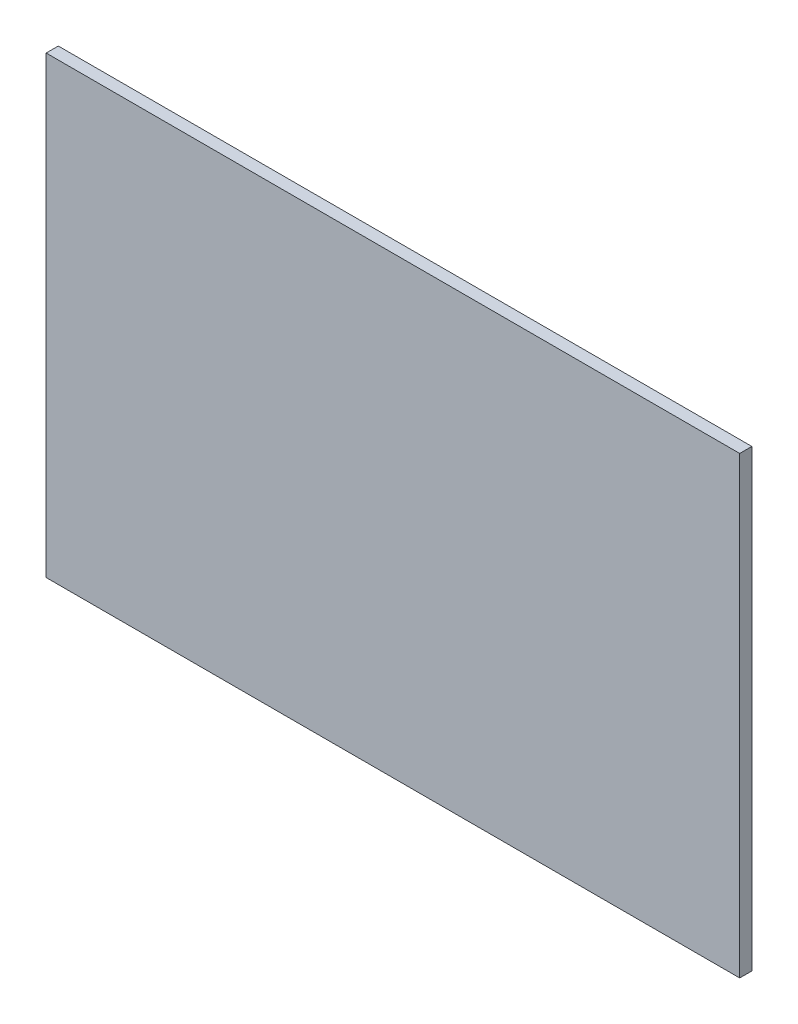
ISO-10303-21;
HEADER;
FILE_DESCRIPTION(('STEP AP214'),'2;1');
FILE_NAME('part.step','',(''),(''),'','','');
FILE_SCHEMA(('AUTOMOTIVE_DESIGN { 1 0 10303 214 1 1 1 1 }'));
ENDSEC;
DATA;
#1=APPLICATION_CONTEXT('core data for automotive mechanical design processes');
#2=APPLICATION_PROTOCOL_DEFINITION('international standard','automotive_design',2000,#1);
#3=PRODUCT_CONTEXT('',#1,'mechanical');
#4=PRODUCT('Part','Part','',(#3));
#5=PRODUCT_RELATED_PRODUCT_CATEGORY('part','',(#4));
#6=PRODUCT_DEFINITION_FORMATION('','',#4);
#7=PRODUCT_DEFINITION_CONTEXT('part definition',#1,'design');
#8=PRODUCT_DEFINITION('design','',#6,#7);
#9=PRODUCT_DEFINITION_SHAPE('','',#8);
#10=(LENGTH_UNIT() NAMED_UNIT(*) SI_UNIT(.MILLI.,.METRE.));
#11=(NAMED_UNIT(*) PLANE_ANGLE_UNIT() SI_UNIT($,.RADIAN.));
#12=(NAMED_UNIT(*) SI_UNIT($,.STERADIAN.) SOLID_ANGLE_UNIT());
#13=UNCERTAINTY_MEASURE_WITH_UNIT(LENGTH_MEASURE(1.E-05),#10,'distance_accuracy_value','');
#14=(GEOMETRIC_REPRESENTATION_CONTEXT(3) GLOBAL_UNCERTAINTY_ASSIGNED_CONTEXT((#13)) GLOBAL_UNIT_ASSIGNED_CONTEXT((#10,
#11,#12)) REPRESENTATION_CONTEXT('',''));
#15=CARTESIAN_POINT('',(0.,0.,0.));
#16=DIRECTION('',(0.,0.,1.));
#17=DIRECTION('',(1.,0.,0.));
#18=AXIS2_PLACEMENT_3D('',#15,#16,#17);
#19=CARTESIAN_POINT('',(-83.6869523809524,-59.0332285714286,-2.54));
#20=DIRECTION('',(0.,-1.,0.));
#21=DIRECTION('',(0.,0.,-1.));
#22=AXIS2_PLACEMENT_3D('',#19,#20,#21);
#23=PLANE('',#22);
#24=DIRECTION('',(1.,0.,0.));
#25=VECTOR('',#24,1.);
#26=CARTESIAN_POINT('',(-83.6869523809524,-59.0332285714286,0.));
#27=LINE('',#26,#25);
#28=CARTESIAN_POINT('',(-83.6869523809524,-59.0332285714286,0.));
#29=VERTEX_POINT('',#28);
#30=CARTESIAN_POINT('',(61.3470476190476,-59.0332285714286,0.));
#31=VERTEX_POINT('',#30);
#32=EDGE_CURVE('E115',#29,#31,#27,.T.);
#33=ORIENTED_EDGE('',*,*,#32,.F.);
#34=DIRECTION('',(0.,0.,1.));
#35=VECTOR('',#34,1.);
#36=CARTESIAN_POINT('',(-83.6869523809524,-59.0332285714286,-2.54));
#37=LINE('',#36,#35);
#38=CARTESIAN_POINT('',(-83.6869523809524,-59.0332285714286,-2.54));
#39=VERTEX_POINT('',#38);
#40=EDGE_CURVE('E11',#39,#29,#37,.T.);
#41=ORIENTED_EDGE('',*,*,#40,.F.);
#42=DIRECTION('',(1.,0.,0.));
#43=VECTOR('',#42,1.);
#44=CARTESIAN_POINT('',(-83.6869523809524,-59.0332285714286,-2.54));
#45=LINE('',#44,#43);
#46=CARTESIAN_POINT('',(61.3470476190476,-59.0332285714286,-2.54));
#47=VERTEX_POINT('',#46);
#48=EDGE_CURVE('E107',#39,#47,#45,.T.);
#49=ORIENTED_EDGE('',*,*,#48,.T.);
#50=DIRECTION('',(0.,0.,1.));
#51=VECTOR('',#50,1.);
#52=CARTESIAN_POINT('',(61.3470476190476,-59.0332285714286,-2.54));
#53=LINE('',#52,#51);
#54=EDGE_CURVE('E48',#47,#31,#53,.T.);
#55=ORIENTED_EDGE('',*,*,#54,.T.);
#56=EDGE_LOOP('',(#33,#41,#49,#55));
#57=FACE_BOUND('',#56,.T.);
#58=ADVANCED_FACE('F45',(#57),#23,.T.);
#59=CARTESIAN_POINT('',(-83.6869523809524,35.9627714285714,-2.54));
#60=DIRECTION('',(-1.,0.,0.));
#61=DIRECTION('',(0.,0.,1.));
#62=AXIS2_PLACEMENT_3D('',#59,#60,#61);
#63=PLANE('',#62);
#64=DIRECTION('',(0.,-1.,0.));
#65=VECTOR('',#64,1.);
#66=CARTESIAN_POINT('',(-83.6869523809524,35.9627714285714,0.));
#67=LINE('',#66,#65);
#68=CARTESIAN_POINT('',(-83.6869523809524,35.9627714285714,0.));
#69=VERTEX_POINT('',#68);
#70=EDGE_CURVE('E110',#69,#29,#67,.T.);
#71=ORIENTED_EDGE('',*,*,#70,.F.);
#72=DIRECTION('',(0.,0.,1.));
#73=VECTOR('',#72,1.);
#74=CARTESIAN_POINT('',(-83.6869523809524,35.9627714285714,-2.54));
#75=LINE('',#74,#73);
#76=CARTESIAN_POINT('',(-83.6869523809524,35.9627714285714,-2.54));
#77=VERTEX_POINT('',#76);
#78=EDGE_CURVE('E55',#77,#69,#75,.T.);
#79=ORIENTED_EDGE('',*,*,#78,.F.);
#80=DIRECTION('',(0.,-1.,0.));
#81=VECTOR('',#80,1.);
#82=CARTESIAN_POINT('',(-83.6869523809524,35.9627714285714,-2.54));
#83=LINE('',#82,#81);
#84=EDGE_CURVE('E94',#77,#39,#83,.T.);
#85=ORIENTED_EDGE('',*,*,#84,.T.);
#86=ORIENTED_EDGE('',*,*,#40,.T.);
#87=EDGE_LOOP('',(#71,#79,#85,#86));
#88=FACE_BOUND('',#87,.T.);
#89=ADVANCED_FACE('F131',(#88),#63,.T.);
#90=CARTESIAN_POINT('',(-83.6869523809524,35.9627714285714,-2.54));
#91=DIRECTION('',(0.,-1.,0.));
#92=DIRECTION('',(0.,0.,-1.));
#93=AXIS2_PLACEMENT_3D('',#90,#91,#92);
#94=PLANE('',#93);
#95=DIRECTION('',(1.,0.,0.));
#96=VECTOR('',#95,1.);
#97=CARTESIAN_POINT('',(-83.6869523809524,35.9627714285714,0.));
#98=LINE('',#97,#96);
#99=CARTESIAN_POINT('',(61.3470476190476,35.9627714285714,0.));
#100=VERTEX_POINT('',#99);
#101=EDGE_CURVE('E100',#69,#100,#98,.T.);
#102=ORIENTED_EDGE('',*,*,#101,.T.);
#103=DIRECTION('',(0.,0.,1.));
#104=VECTOR('',#103,1.);
#105=CARTESIAN_POINT('',(61.3470476190476,35.9627714285714,-2.54));
#106=LINE('',#105,#104);
#107=CARTESIAN_POINT('',(61.3470476190476,35.9627714285714,-2.54));
#108=VERTEX_POINT('',#107);
#109=EDGE_CURVE('E98',#108,#100,#106,.T.);
#110=ORIENTED_EDGE('',*,*,#109,.F.);
#111=DIRECTION('',(1.,0.,0.));
#112=VECTOR('',#111,1.);
#113=CARTESIAN_POINT('',(-83.6869523809524,35.9627714285714,-2.54));
#114=LINE('',#113,#112);
#115=EDGE_CURVE('E91',#77,#108,#114,.T.);
#116=ORIENTED_EDGE('',*,*,#115,.F.);
#117=ORIENTED_EDGE('',*,*,#78,.T.);
#118=EDGE_LOOP('',(#102,#110,#116,#117));
#119=FACE_BOUND('',#118,.T.);
#120=ADVANCED_FACE('F99',(#119),#94,.F.);
#121=CARTESIAN_POINT('',(61.3470476190476,35.9627714285714,-2.54));
#122=DIRECTION('',(-1.,0.,0.));
#123=DIRECTION('',(0.,0.,1.));
#124=AXIS2_PLACEMENT_3D('',#121,#122,#123);
#125=PLANE('',#124);
#126=DIRECTION('',(0.,-1.,0.));
#127=VECTOR('',#126,1.);
#128=CARTESIAN_POINT('',(61.3470476190476,35.9627714285714,0.));
#129=LINE('',#128,#127);
#130=EDGE_CURVE('E119',#100,#31,#129,.T.);
#131=ORIENTED_EDGE('',*,*,#130,.T.);
#132=ORIENTED_EDGE('',*,*,#54,.F.);
#133=DIRECTION('',(0.,-1.,0.));
#134=VECTOR('',#133,1.);
#135=CARTESIAN_POINT('',(61.3470476190476,35.9627714285714,-2.54));
#136=LINE('',#135,#134);
#137=EDGE_CURVE('E88',#108,#47,#136,.T.);
#138=ORIENTED_EDGE('',*,*,#137,.F.);
#139=ORIENTED_EDGE('',*,*,#109,.T.);
#140=EDGE_LOOP('',(#131,#132,#138,#139));
#141=FACE_BOUND('',#140,.T.);
#142=ADVANCED_FACE('F105',(#141),#125,.F.);
#143=CARTESIAN_POINT('',(0.,0.,-2.54));
#144=DIRECTION('',(0.,0.,-1.));
#145=DIRECTION('',(-1.,0.,0.));
#146=AXIS2_PLACEMENT_3D('',#143,#144,#145);
#147=PLANE('',#146);
#148=ORIENTED_EDGE('',*,*,#48,.F.);
#149=ORIENTED_EDGE('',*,*,#84,.F.);
#150=ORIENTED_EDGE('',*,*,#115,.T.);
#151=ORIENTED_EDGE('',*,*,#137,.T.);
#152=EDGE_LOOP('',(#148,#149,#150,#151));
#153=FACE_BOUND('',#152,.T.);
#154=ADVANCED_FACE('F93',(#153),#147,.T.);
#155=CARTESIAN_POINT('',(0.,0.,0.));
#156=DIRECTION('',(0.,0.,-1.));
#157=DIRECTION('',(-1.,0.,0.));
#158=AXIS2_PLACEMENT_3D('',#155,#156,#157);
#159=PLANE('',#158);
#160=ORIENTED_EDGE('',*,*,#32,.T.);
#161=ORIENTED_EDGE('',*,*,#130,.F.);
#162=ORIENTED_EDGE('',*,*,#101,.F.);
#163=ORIENTED_EDGE('',*,*,#70,.T.);
#164=EDGE_LOOP('',(#160,#161,#162,#163));
#165=FACE_BOUND('',#164,.T.);
#166=ADVANCED_FACE('F130',(#165),#159,.F.);
#167=CLOSED_SHELL('',(#58,#89,#120,#142,#154,#166));
#168=MANIFOLD_SOLID_BREP('B2',#167);
#169=ADVANCED_BREP_SHAPE_REPRESENTATION('',(#18,#168),#14);
#170=SHAPE_DEFINITION_REPRESENTATION(#9,#169);
ENDSEC;
END-ISO-10303-21;
